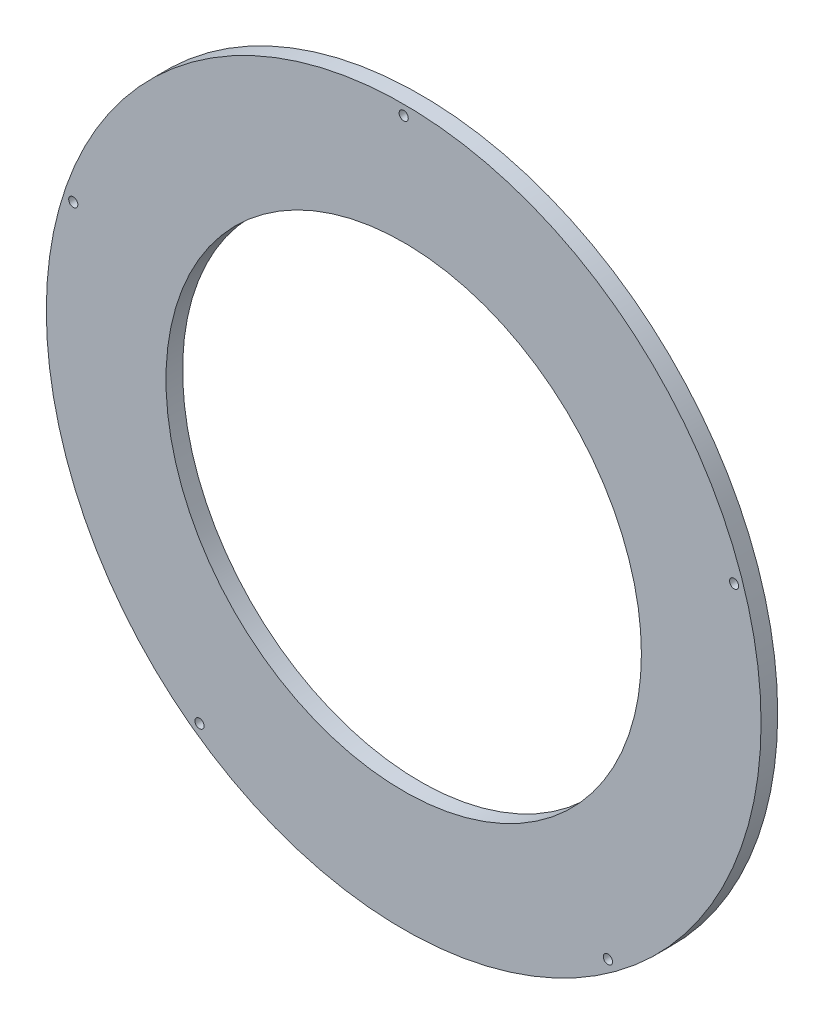
ISO-10303-21;
HEADER;
FILE_DESCRIPTION(('STEP AP214'),'2;1');
FILE_NAME('part.step','',(''),(''),'','','');
FILE_SCHEMA(('AUTOMOTIVE_DESIGN { 1 0 10303 214 1 1 1 1 }'));
ENDSEC;
DATA;
#1=APPLICATION_CONTEXT('core data for automotive mechanical design processes');
#2=APPLICATION_PROTOCOL_DEFINITION('international standard','automotive_design',2000,#1);
#3=PRODUCT_CONTEXT('',#1,'mechanical');
#4=PRODUCT('Part','Part','',(#3));
#5=PRODUCT_RELATED_PRODUCT_CATEGORY('part','',(#4));
#6=PRODUCT_DEFINITION_FORMATION('','',#4);
#7=PRODUCT_DEFINITION_CONTEXT('part definition',#1,'design');
#8=PRODUCT_DEFINITION('design','',#6,#7);
#9=PRODUCT_DEFINITION_SHAPE('','',#8);
#10=(LENGTH_UNIT() NAMED_UNIT(*) SI_UNIT(.MILLI.,.METRE.));
#11=(NAMED_UNIT(*) PLANE_ANGLE_UNIT() SI_UNIT($,.RADIAN.));
#12=(NAMED_UNIT(*) SI_UNIT($,.STERADIAN.) SOLID_ANGLE_UNIT());
#13=UNCERTAINTY_MEASURE_WITH_UNIT(LENGTH_MEASURE(1.E-05),#10,'distance_accuracy_value','');
#14=(GEOMETRIC_REPRESENTATION_CONTEXT(3) GLOBAL_UNCERTAINTY_ASSIGNED_CONTEXT((#13)) GLOBAL_UNIT_ASSIGNED_CONTEXT((#10,
#11,#12)) REPRESENTATION_CONTEXT('',''));
#15=CARTESIAN_POINT('',(0.,0.,0.));
#16=DIRECTION('',(0.,0.,1.));
#17=DIRECTION('',(1.,0.,0.));
#18=AXIS2_PLACEMENT_3D('',#15,#16,#17);
#19=CARTESIAN_POINT('',(0.,0.,0.));
#20=DIRECTION('',(0.,0.,1.));
#21=DIRECTION('',(1.,0.,0.));
#22=AXIS2_PLACEMENT_3D('',#19,#20,#21);
#23=PLANE('',#22);
#24=CARTESIAN_POINT('',(0.,0.,0.));
#25=DIRECTION('',(0.,0.,1.));
#26=DIRECTION('',(1.,0.,0.));
#27=AXIS2_PLACEMENT_3D('',#24,#25,#26);
#28=CIRCLE('',#27,143.);
#29=CARTESIAN_POINT('',(143.,0.,0.));
#30=VERTEX_POINT('',#29);
#31=EDGE_CURVE('E50',#30,#30,#28,.T.);
#32=ORIENTED_EDGE('',*,*,#31,.T.);
#33=EDGE_LOOP('',(#32));
#34=FACE_BOUND('',#33,.T.);
#35=CARTESIAN_POINT('',(0.,0.,0.));
#36=DIRECTION('',(0.,0.,1.));
#37=DIRECTION('',(1.,0.,0.));
#38=AXIS2_PLACEMENT_3D('',#35,#36,#37);
#39=CIRCLE('',#38,144.);
#40=CARTESIAN_POINT('',(144.,0.,0.));
#41=VERTEX_POINT('',#40);
#42=EDGE_CURVE('E62',#41,#41,#39,.T.);
#43=ORIENTED_EDGE('',*,*,#42,.F.);
#44=EDGE_LOOP('',(#43));
#45=FACE_BOUND('',#44,.T.);
#46=ADVANCED_FACE('F37',(#34,#45),#23,.F.);
#47=CARTESIAN_POINT('',(0.,0.,10.));
#48=DIRECTION('',(0.,0.,1.));
#49=DIRECTION('',(1.,0.,0.));
#50=AXIS2_PLACEMENT_3D('',#47,#48,#49);
#51=PLANE('',#50);
#52=CARTESIAN_POINT('',(198.770811905687,64.584551824364,10.));
#53=DIRECTION('',(0.,0.,1.));
#54=DIRECTION('',(1.,0.,0.));
#55=AXIS2_PLACEMENT_3D('',#52,#53,#54);
#56=CIRCLE('',#55,2.75);
#57=CARTESIAN_POINT('',(201.520811905687,64.584551824364,10.));
#58=VERTEX_POINT('',#57);
#59=EDGE_CURVE('E65',#58,#58,#56,.T.);
#60=ORIENTED_EDGE('',*,*,#59,.F.);
#61=EDGE_LOOP('',(#60));
#62=FACE_BOUND('',#61,.T.);
#63=CARTESIAN_POINT('',(0.,209.,10.));
#64=DIRECTION('',(0.,0.,1.));
#65=DIRECTION('',(1.,0.,0.));
#66=AXIS2_PLACEMENT_3D('',#63,#64,#65);
#67=CIRCLE('',#66,2.75);
#68=CARTESIAN_POINT('',(2.75000000000001,209.,10.));
#69=VERTEX_POINT('',#68);
#70=EDGE_CURVE('E86',#69,#69,#67,.T.);
#71=ORIENTED_EDGE('',*,*,#70,.F.);
#72=EDGE_LOOP('',(#71));
#73=FACE_BOUND('',#72,.T.);
#74=CARTESIAN_POINT('',(-198.770811905687,64.584551824364,10.));
#75=DIRECTION('',(0.,0.,1.));
#76=DIRECTION('',(1.,0.,0.));
#77=AXIS2_PLACEMENT_3D('',#74,#75,#76);
#78=CIRCLE('',#77,2.75);
#79=CARTESIAN_POINT('',(-196.020811905687,64.584551824364,10.));
#80=VERTEX_POINT('',#79);
#81=EDGE_CURVE('E80',#80,#80,#78,.T.);
#82=ORIENTED_EDGE('',*,*,#81,.F.);
#83=EDGE_LOOP('',(#82));
#84=FACE_BOUND('',#83,.T.);
#85=CARTESIAN_POINT('',(-122.847117729127,-169.084551824364,10.));
#86=DIRECTION('',(0.,0.,1.));
#87=DIRECTION('',(1.,0.,0.));
#88=AXIS2_PLACEMENT_3D('',#85,#86,#87);
#89=CIRCLE('',#88,2.75);
#90=CARTESIAN_POINT('',(-120.097117729127,-169.084551824364,10.));
#91=VERTEX_POINT('',#90);
#92=EDGE_CURVE('E74',#91,#91,#89,.T.);
#93=ORIENTED_EDGE('',*,*,#92,.F.);
#94=EDGE_LOOP('',(#93));
#95=FACE_BOUND('',#94,.T.);
#96=CARTESIAN_POINT('',(122.847117729127,-169.084551824364,10.));
#97=DIRECTION('',(0.,0.,1.));
#98=DIRECTION('',(1.,0.,0.));
#99=AXIS2_PLACEMENT_3D('',#96,#97,#98);
#100=CIRCLE('',#99,2.74999999999999);
#101=CARTESIAN_POINT('',(125.597117729127,-169.084551824364,10.));
#102=VERTEX_POINT('',#101);
#103=EDGE_CURVE('E68',#102,#102,#100,.T.);
#104=ORIENTED_EDGE('',*,*,#103,.F.);
#105=EDGE_LOOP('',(#104));
#106=FACE_BOUND('',#105,.T.);
#107=CARTESIAN_POINT('',(0.,0.,10.));
#108=DIRECTION('',(0.,0.,1.));
#109=DIRECTION('',(1.,0.,0.));
#110=AXIS2_PLACEMENT_3D('',#107,#108,#109);
#111=CIRCLE('',#110,215.);
#112=CARTESIAN_POINT('',(215.,0.,10.));
#113=VERTEX_POINT('',#112);
#114=EDGE_CURVE('E10',#113,#113,#111,.T.);
#115=ORIENTED_EDGE('',*,*,#114,.T.);
#116=EDGE_LOOP('',(#115));
#117=FACE_BOUND('',#116,.T.);
#118=CARTESIAN_POINT('',(0.,0.,10.));
#119=DIRECTION('',(0.,0.,1.));
#120=DIRECTION('',(1.,0.,0.));
#121=AXIS2_PLACEMENT_3D('',#118,#119,#120);
#122=CIRCLE('',#121,143.);
#123=CARTESIAN_POINT('',(143.,0.,10.));
#124=VERTEX_POINT('',#123);
#125=EDGE_CURVE('E48',#124,#124,#122,.T.);
#126=ORIENTED_EDGE('',*,*,#125,.F.);
#127=EDGE_LOOP('',(#126));
#128=FACE_BOUND('',#127,.T.);
#129=ADVANCED_FACE('F101',(#62,#73,#84,#95,#106,#117,#128),#51,.T.);
#130=CARTESIAN_POINT('',(198.770811905687,64.584551824364,0.));
#131=DIRECTION('',(0.,0.,1.));
#132=DIRECTION('',(1.,0.,0.));
#133=AXIS2_PLACEMENT_3D('',#130,#131,#132);
#134=CIRCLE('',#133,2.75);
#135=CARTESIAN_POINT('',(201.520811905687,64.584551824364,0.));
#136=VERTEX_POINT('',#135);
#137=EDGE_CURVE('E92',#136,#136,#134,.T.);
#138=ORIENTED_EDGE('',*,*,#137,.T.);
#139=EDGE_LOOP('',(#138));
#140=FACE_BOUND('',#139,.T.);
#141=CARTESIAN_POINT('',(0.,209.,0.));
#142=DIRECTION('',(0.,0.,1.));
#143=DIRECTION('',(1.,0.,0.));
#144=AXIS2_PLACEMENT_3D('',#141,#142,#143);
#145=CIRCLE('',#144,2.75);
#146=CARTESIAN_POINT('',(2.75000000000001,209.,0.));
#147=VERTEX_POINT('',#146);
#148=EDGE_CURVE('E89',#147,#147,#145,.T.);
#149=ORIENTED_EDGE('',*,*,#148,.T.);
#150=EDGE_LOOP('',(#149));
#151=FACE_BOUND('',#150,.T.);
#152=CARTESIAN_POINT('',(-198.770811905687,64.584551824364,0.));
#153=DIRECTION('',(0.,0.,1.));
#154=DIRECTION('',(1.,0.,0.));
#155=AXIS2_PLACEMENT_3D('',#152,#153,#154);
#156=CIRCLE('',#155,2.75);
#157=CARTESIAN_POINT('',(-196.020811905687,64.584551824364,0.));
#158=VERTEX_POINT('',#157);
#159=EDGE_CURVE('E83',#158,#158,#156,.T.);
#160=ORIENTED_EDGE('',*,*,#159,.T.);
#161=EDGE_LOOP('',(#160));
#162=FACE_BOUND('',#161,.T.);
#163=CARTESIAN_POINT('',(-122.847117729127,-169.084551824364,0.));
#164=DIRECTION('',(0.,0.,1.));
#165=DIRECTION('',(1.,0.,0.));
#166=AXIS2_PLACEMENT_3D('',#163,#164,#165);
#167=CIRCLE('',#166,2.75);
#168=CARTESIAN_POINT('',(-120.097117729127,-169.084551824364,0.));
#169=VERTEX_POINT('',#168);
#170=EDGE_CURVE('E77',#169,#169,#167,.T.);
#171=ORIENTED_EDGE('',*,*,#170,.T.);
#172=EDGE_LOOP('',(#171));
#173=FACE_BOUND('',#172,.T.);
#174=CARTESIAN_POINT('',(122.847117729127,-169.084551824364,0.));
#175=DIRECTION('',(0.,0.,1.));
#176=DIRECTION('',(1.,0.,0.));
#177=AXIS2_PLACEMENT_3D('',#174,#175,#176);
#178=CIRCLE('',#177,2.74999999999999);
#179=CARTESIAN_POINT('',(125.597117729127,-169.084551824364,0.));
#180=VERTEX_POINT('',#179);
#181=EDGE_CURVE('E71',#180,#180,#178,.T.);
#182=ORIENTED_EDGE('',*,*,#181,.T.);
#183=EDGE_LOOP('',(#182));
#184=FACE_BOUND('',#183,.T.);
#185=CARTESIAN_POINT('',(0.,0.,0.));
#186=DIRECTION('',(0.,0.,1.));
#187=DIRECTION('',(1.,0.,0.));
#188=AXIS2_PLACEMENT_3D('',#185,#186,#187);
#189=CIRCLE('',#188,204.);
#190=CARTESIAN_POINT('',(204.,0.,0.));
#191=VERTEX_POINT('',#190);
#192=EDGE_CURVE('E56',#191,#191,#189,.T.);
#193=ORIENTED_EDGE('',*,*,#192,.T.);
#194=EDGE_LOOP('',(#193));
#195=FACE_BOUND('',#194,.T.);
#196=CARTESIAN_POINT('',(0.,0.,0.));
#197=DIRECTION('',(0.,0.,1.));
#198=DIRECTION('',(1.,0.,0.));
#199=AXIS2_PLACEMENT_3D('',#196,#197,#198);
#200=CIRCLE('',#199,215.);
#201=CARTESIAN_POINT('',(215.,0.,0.));
#202=VERTEX_POINT('',#201);
#203=EDGE_CURVE('E41',#202,#202,#200,.T.);
#204=ORIENTED_EDGE('',*,*,#203,.F.);
#205=EDGE_LOOP('',(#204));
#206=FACE_BOUND('',#205,.T.);
#207=ADVANCED_FACE('F104',(#140,#151,#162,#173,#184,#195,#206),#23,.F.);
#208=CARTESIAN_POINT('',(0.,0.,10.));
#209=DIRECTION('',(0.,0.,-1.));
#210=DIRECTION('',(-1.,0.,0.));
#211=AXIS2_PLACEMENT_3D('',#208,#209,#210);
#212=CYLINDRICAL_SURFACE('',#211,215.);
#213=ORIENTED_EDGE('',*,*,#114,.F.);
#214=EDGE_LOOP('',(#213));
#215=FACE_BOUND('',#214,.T.);
#216=ORIENTED_EDGE('',*,*,#203,.T.);
#217=EDGE_LOOP('',(#216));
#218=FACE_BOUND('',#217,.T.);
#219=ADVANCED_FACE('F39',(#215,#218),#212,.T.);
#220=CARTESIAN_POINT('',(0.,0.,10.));
#221=DIRECTION('',(0.,0.,-1.));
#222=DIRECTION('',(-1.,0.,0.));
#223=AXIS2_PLACEMENT_3D('',#220,#221,#222);
#224=CYLINDRICAL_SURFACE('',#223,143.);
#225=ORIENTED_EDGE('',*,*,#125,.T.);
#226=EDGE_LOOP('',(#225));
#227=FACE_BOUND('',#226,.T.);
#228=ORIENTED_EDGE('',*,*,#31,.F.);
#229=EDGE_LOOP('',(#228));
#230=FACE_BOUND('',#229,.T.);
#231=ADVANCED_FACE('F116',(#227,#230),#224,.F.);
#232=CARTESIAN_POINT('',(0.,0.,4.));
#233=DIRECTION('',(0.,0.,1.));
#234=DIRECTION('',(1.,0.,0.));
#235=AXIS2_PLACEMENT_3D('',#232,#233,#234);
#236=PLANE('',#235);
#237=CARTESIAN_POINT('',(0.,0.,4.));
#238=DIRECTION('',(0.,0.,1.));
#239=DIRECTION('',(1.,0.,0.));
#240=AXIS2_PLACEMENT_3D('',#237,#238,#239);
#241=CIRCLE('',#240,204.);
#242=CARTESIAN_POINT('',(204.,0.,4.));
#243=VERTEX_POINT('',#242);
#244=EDGE_CURVE('E53',#243,#243,#241,.T.);
#245=ORIENTED_EDGE('',*,*,#244,.F.);
#246=EDGE_LOOP('',(#245));
#247=FACE_BOUND('',#246,.T.);
#248=CARTESIAN_POINT('',(0.,0.,4.));
#249=DIRECTION('',(0.,0.,1.));
#250=DIRECTION('',(1.,0.,0.));
#251=AXIS2_PLACEMENT_3D('',#248,#249,#250);
#252=CIRCLE('',#251,144.);
#253=CARTESIAN_POINT('',(144.,0.,4.));
#254=VERTEX_POINT('',#253);
#255=EDGE_CURVE('E59',#254,#254,#252,.T.);
#256=ORIENTED_EDGE('',*,*,#255,.T.);
#257=EDGE_LOOP('',(#256));
#258=FACE_BOUND('',#257,.T.);
#259=ADVANCED_FACE('F119',(#247,#258),#236,.F.);
#260=CARTESIAN_POINT('',(0.,0.,4.));
#261=DIRECTION('',(0.,0.,-1.));
#262=DIRECTION('',(-1.,0.,0.));
#263=AXIS2_PLACEMENT_3D('',#260,#261,#262);
#264=CYLINDRICAL_SURFACE('',#263,204.);
#265=ORIENTED_EDGE('',*,*,#244,.T.);
#266=EDGE_LOOP('',(#265));
#267=FACE_BOUND('',#266,.T.);
#268=ORIENTED_EDGE('',*,*,#192,.F.);
#269=EDGE_LOOP('',(#268));
#270=FACE_BOUND('',#269,.T.);
#271=ADVANCED_FACE('F130',(#267,#270),#264,.F.);
#272=CARTESIAN_POINT('',(0.,0.,4.));
#273=DIRECTION('',(0.,0.,-1.));
#274=DIRECTION('',(-1.,0.,0.));
#275=AXIS2_PLACEMENT_3D('',#272,#273,#274);
#276=CYLINDRICAL_SURFACE('',#275,144.);
#277=ORIENTED_EDGE('',*,*,#255,.F.);
#278=EDGE_LOOP('',(#277));
#279=FACE_BOUND('',#278,.T.);
#280=ORIENTED_EDGE('',*,*,#42,.T.);
#281=EDGE_LOOP('',(#280));
#282=FACE_BOUND('',#281,.T.);
#283=ADVANCED_FACE('F127',(#279,#282),#276,.T.);
#284=CARTESIAN_POINT('',(122.847117729127,-169.084551824364,10.));
#285=DIRECTION('',(0.,0.,-1.));
#286=DIRECTION('',(-1.,0.,0.));
#287=AXIS2_PLACEMENT_3D('',#284,#285,#286);
#288=CYLINDRICAL_SURFACE('',#287,2.74999999999999);
#289=ORIENTED_EDGE('',*,*,#103,.T.);
#290=EDGE_LOOP('',(#289));
#291=FACE_BOUND('',#290,.T.);
#292=ORIENTED_EDGE('',*,*,#181,.F.);
#293=EDGE_LOOP('',(#292));
#294=FACE_BOUND('',#293,.T.);
#295=ADVANCED_FACE('F129',(#291,#294),#288,.F.);
#296=CARTESIAN_POINT('',(-122.847117729127,-169.084551824364,10.));
#297=DIRECTION('',(0.,0.,-1.));
#298=DIRECTION('',(-1.,0.,0.));
#299=AXIS2_PLACEMENT_3D('',#296,#297,#298);
#300=CYLINDRICAL_SURFACE('',#299,2.75);
#301=ORIENTED_EDGE('',*,*,#92,.T.);
#302=EDGE_LOOP('',(#301));
#303=FACE_BOUND('',#302,.T.);
#304=ORIENTED_EDGE('',*,*,#170,.F.);
#305=EDGE_LOOP('',(#304));
#306=FACE_BOUND('',#305,.T.);
#307=ADVANCED_FACE('F137',(#303,#306),#300,.F.);
#308=CARTESIAN_POINT('',(-198.770811905687,64.584551824364,10.));
#309=DIRECTION('',(0.,0.,-1.));
#310=DIRECTION('',(-1.,0.,0.));
#311=AXIS2_PLACEMENT_3D('',#308,#309,#310);
#312=CYLINDRICAL_SURFACE('',#311,2.75);
#313=ORIENTED_EDGE('',*,*,#81,.T.);
#314=EDGE_LOOP('',(#313));
#315=FACE_BOUND('',#314,.T.);
#316=ORIENTED_EDGE('',*,*,#159,.F.);
#317=EDGE_LOOP('',(#316));
#318=FACE_BOUND('',#317,.T.);
#319=ADVANCED_FACE('F171',(#315,#318),#312,.F.);
#320=CARTESIAN_POINT('',(0.,209.,10.));
#321=DIRECTION('',(0.,0.,-1.));
#322=DIRECTION('',(-1.,0.,0.));
#323=AXIS2_PLACEMENT_3D('',#320,#321,#322);
#324=CYLINDRICAL_SURFACE('',#323,2.75);
#325=ORIENTED_EDGE('',*,*,#70,.T.);
#326=EDGE_LOOP('',(#325));
#327=FACE_BOUND('',#326,.T.);
#328=ORIENTED_EDGE('',*,*,#148,.F.);
#329=EDGE_LOOP('',(#328));
#330=FACE_BOUND('',#329,.T.);
#331=ADVANCED_FACE('F176',(#327,#330),#324,.F.);
#332=CARTESIAN_POINT('',(198.770811905687,64.584551824364,10.));
#333=DIRECTION('',(0.,0.,-1.));
#334=DIRECTION('',(-1.,0.,0.));
#335=AXIS2_PLACEMENT_3D('',#332,#333,#334);
#336=CYLINDRICAL_SURFACE('',#335,2.75);
#337=ORIENTED_EDGE('',*,*,#59,.T.);
#338=EDGE_LOOP('',(#337));
#339=FACE_BOUND('',#338,.T.);
#340=ORIENTED_EDGE('',*,*,#137,.F.);
#341=EDGE_LOOP('',(#340));
#342=FACE_BOUND('',#341,.T.);
#343=ADVANCED_FACE('F98',(#339,#342),#336,.F.);
#344=CLOSED_SHELL('',(#46,#129,#207,#219,#231,#259,#271,#283,#295,#307,#319,#331,#343));
#345=MANIFOLD_SOLID_BREP('B2',#344);
#346=ADVANCED_BREP_SHAPE_REPRESENTATION('',(#18,#345),#14);
#347=SHAPE_DEFINITION_REPRESENTATION(#9,#346);
ENDSEC;
END-ISO-10303-21;
